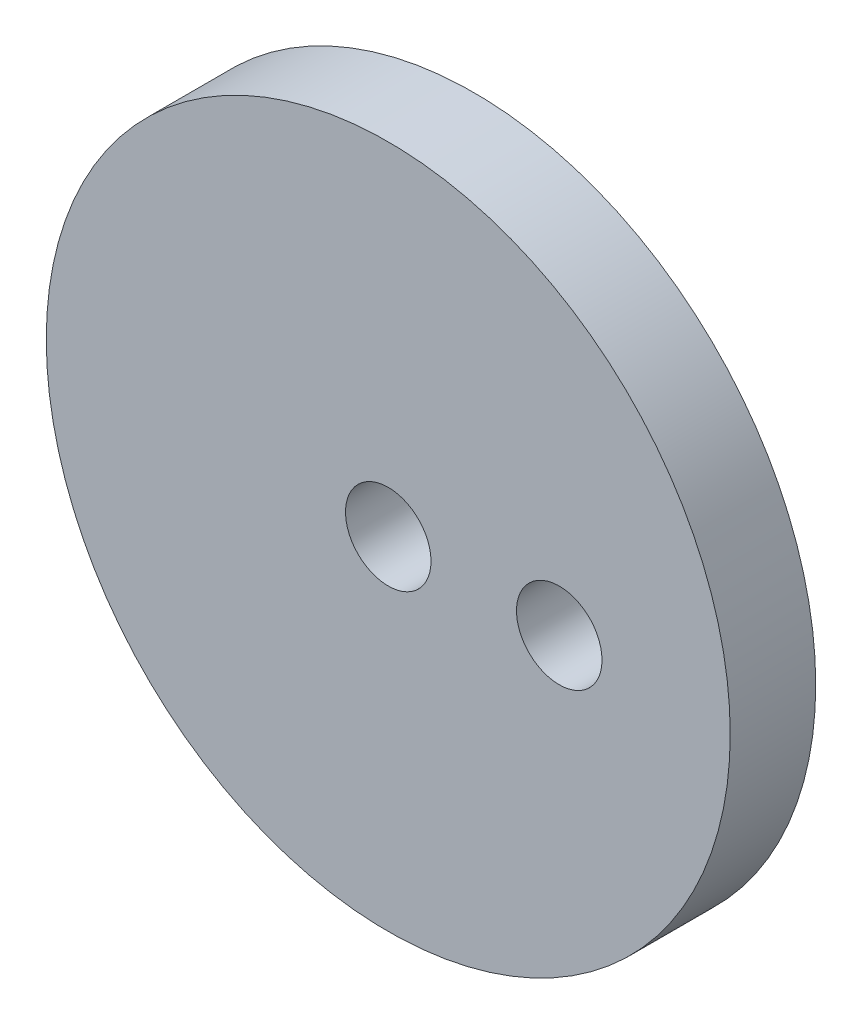
ISO-10303-21;
HEADER;
FILE_DESCRIPTION(('STEP AP214'),'2;1');
FILE_NAME('part.step','',(''),(''),'','','');
FILE_SCHEMA(('AUTOMOTIVE_DESIGN { 1 0 10303 214 1 1 1 1 }'));
ENDSEC;
DATA;
#1=APPLICATION_CONTEXT('core data for automotive mechanical design processes');
#2=APPLICATION_PROTOCOL_DEFINITION('international standard','automotive_design',2000,#1);
#3=PRODUCT_CONTEXT('',#1,'mechanical');
#4=PRODUCT('Part','Part','',(#3));
#5=PRODUCT_RELATED_PRODUCT_CATEGORY('part','',(#4));
#6=PRODUCT_DEFINITION_FORMATION('','',#4);
#7=PRODUCT_DEFINITION_CONTEXT('part definition',#1,'design');
#8=PRODUCT_DEFINITION('design','',#6,#7);
#9=PRODUCT_DEFINITION_SHAPE('','',#8);
#10=(LENGTH_UNIT() NAMED_UNIT(*) SI_UNIT(.MILLI.,.METRE.));
#11=(NAMED_UNIT(*) PLANE_ANGLE_UNIT() SI_UNIT($,.RADIAN.));
#12=(NAMED_UNIT(*) SI_UNIT($,.STERADIAN.) SOLID_ANGLE_UNIT());
#13=UNCERTAINTY_MEASURE_WITH_UNIT(LENGTH_MEASURE(1.E-05),#10,'distance_accuracy_value','');
#14=(GEOMETRIC_REPRESENTATION_CONTEXT(3) GLOBAL_UNCERTAINTY_ASSIGNED_CONTEXT((#13)) GLOBAL_UNIT_ASSIGNED_CONTEXT((#10,
#11,#12)) REPRESENTATION_CONTEXT('',''));
#15=CARTESIAN_POINT('',(0.,0.,0.));
#16=DIRECTION('',(0.,0.,1.));
#17=DIRECTION('',(1.,0.,0.));
#18=AXIS2_PLACEMENT_3D('',#15,#16,#17);
#19=CARTESIAN_POINT('',(0.,0.,6.35));
#20=DIRECTION('',(0.,0.,-1.));
#21=DIRECTION('',(-1.,0.,0.));
#22=AXIS2_PLACEMENT_3D('',#19,#20,#21);
#23=CYLINDRICAL_SURFACE('',#22,25.4);
#24=CARTESIAN_POINT('',(0.,0.,6.35));
#25=DIRECTION('',(0.,0.,1.));
#26=DIRECTION('',(1.,0.,0.));
#27=AXIS2_PLACEMENT_3D('',#24,#25,#26);
#28=CIRCLE('',#27,25.4);
#29=CARTESIAN_POINT('',(25.4,0.,6.35));
#30=VERTEX_POINT('',#29);
#31=EDGE_CURVE('E10',#30,#30,#28,.T.);
#32=ORIENTED_EDGE('',*,*,#31,.F.);
#33=EDGE_LOOP('',(#32));
#34=FACE_BOUND('',#33,.T.);
#35=CARTESIAN_POINT('',(0.,0.,0.));
#36=DIRECTION('',(0.,0.,1.));
#37=DIRECTION('',(1.,0.,0.));
#38=AXIS2_PLACEMENT_3D('',#35,#36,#37);
#39=CIRCLE('',#38,25.4);
#40=CARTESIAN_POINT('',(25.4,0.,0.));
#41=VERTEX_POINT('',#40);
#42=EDGE_CURVE('E46',#41,#41,#39,.T.);
#43=ORIENTED_EDGE('',*,*,#42,.T.);
#44=EDGE_LOOP('',(#43));
#45=FACE_BOUND('',#44,.T.);
#46=ADVANCED_FACE('F43',(#34,#45),#23,.T.);
#47=CARTESIAN_POINT('',(0.,0.,6.35));
#48=DIRECTION('',(0.,0.,1.));
#49=DIRECTION('',(1.,0.,0.));
#50=AXIS2_PLACEMENT_3D('',#47,#48,#49);
#51=PLANE('',#50);
#52=CARTESIAN_POINT('',(12.7,0.,6.35));
#53=DIRECTION('',(0.,0.,1.));
#54=DIRECTION('',(1.,0.,0.));
#55=AXIS2_PLACEMENT_3D('',#52,#53,#54);
#56=CIRCLE('',#55,3.175);
#57=CARTESIAN_POINT('',(15.875,0.,6.35));
#58=VERTEX_POINT('',#57);
#59=EDGE_CURVE('E65',#58,#58,#56,.T.);
#60=ORIENTED_EDGE('',*,*,#59,.F.);
#61=EDGE_LOOP('',(#60));
#62=FACE_BOUND('',#61,.T.);
#63=CARTESIAN_POINT('',(0.,0.,6.35));
#64=DIRECTION('',(0.,0.,1.));
#65=DIRECTION('',(1.,0.,0.));
#66=AXIS2_PLACEMENT_3D('',#63,#64,#65);
#67=CIRCLE('',#66,3.175);
#68=CARTESIAN_POINT('',(3.175,0.,6.35));
#69=VERTEX_POINT('',#68);
#70=EDGE_CURVE('E61',#69,#69,#67,.T.);
#71=ORIENTED_EDGE('',*,*,#70,.F.);
#72=EDGE_LOOP('',(#71));
#73=FACE_BOUND('',#72,.T.);
#74=ORIENTED_EDGE('',*,*,#31,.T.);
#75=EDGE_LOOP('',(#74));
#76=FACE_BOUND('',#75,.T.);
#77=ADVANCED_FACE('F83',(#62,#73,#76),#51,.T.);
#78=CARTESIAN_POINT('',(0.,0.,0.));
#79=DIRECTION('',(0.,0.,1.));
#80=DIRECTION('',(1.,0.,0.));
#81=AXIS2_PLACEMENT_3D('',#78,#79,#80);
#82=PLANE('',#81);
#83=CARTESIAN_POINT('',(12.7,0.,0.));
#84=DIRECTION('',(0.,0.,1.));
#85=DIRECTION('',(1.,0.,0.));
#86=AXIS2_PLACEMENT_3D('',#83,#84,#85);
#87=CIRCLE('',#86,3.175);
#88=CARTESIAN_POINT('',(15.875,0.,0.));
#89=VERTEX_POINT('',#88);
#90=EDGE_CURVE('E55',#89,#89,#87,.T.);
#91=ORIENTED_EDGE('',*,*,#90,.T.);
#92=EDGE_LOOP('',(#91));
#93=FACE_BOUND('',#92,.T.);
#94=CARTESIAN_POINT('',(0.,0.,0.));
#95=DIRECTION('',(0.,0.,1.));
#96=DIRECTION('',(1.,0.,0.));
#97=AXIS2_PLACEMENT_3D('',#94,#95,#96);
#98=CIRCLE('',#97,3.175);
#99=CARTESIAN_POINT('',(3.175,0.,0.));
#100=VERTEX_POINT('',#99);
#101=EDGE_CURVE('E57',#100,#100,#98,.T.);
#102=ORIENTED_EDGE('',*,*,#101,.T.);
#103=EDGE_LOOP('',(#102));
#104=FACE_BOUND('',#103,.T.);
#105=ORIENTED_EDGE('',*,*,#42,.F.);
#106=EDGE_LOOP('',(#105));
#107=FACE_BOUND('',#106,.T.);
#108=ADVANCED_FACE('F73',(#93,#104,#107),#82,.F.);
#109=CARTESIAN_POINT('',(0.,0.,0.));
#110=DIRECTION('',(0.,0.,1.));
#111=DIRECTION('',(1.,0.,0.));
#112=AXIS2_PLACEMENT_3D('',#109,#110,#111);
#113=CYLINDRICAL_SURFACE('',#112,3.175);
#114=ORIENTED_EDGE('',*,*,#101,.F.);
#115=EDGE_LOOP('',(#114));
#116=FACE_BOUND('',#115,.T.);
#117=ORIENTED_EDGE('',*,*,#70,.T.);
#118=EDGE_LOOP('',(#117));
#119=FACE_BOUND('',#118,.T.);
#120=ADVANCED_FACE('F79',(#116,#119),#113,.F.);
#121=CARTESIAN_POINT('',(12.7,0.,0.));
#122=DIRECTION('',(0.,0.,1.));
#123=DIRECTION('',(1.,0.,0.));
#124=AXIS2_PLACEMENT_3D('',#121,#122,#123);
#125=CYLINDRICAL_SURFACE('',#124,3.175);
#126=ORIENTED_EDGE('',*,*,#90,.F.);
#127=EDGE_LOOP('',(#126));
#128=FACE_BOUND('',#127,.T.);
#129=ORIENTED_EDGE('',*,*,#59,.T.);
#130=EDGE_LOOP('',(#129));
#131=FACE_BOUND('',#130,.T.);
#132=ADVANCED_FACE('F76',(#128,#131),#125,.F.);
#133=CLOSED_SHELL('',(#46,#77,#108,#120,#132));
#134=MANIFOLD_SOLID_BREP('B2',#133);
#135=ADVANCED_BREP_SHAPE_REPRESENTATION('',(#18,#134),#14);
#136=SHAPE_DEFINITION_REPRESENTATION(#9,#135);
ENDSEC;
END-ISO-10303-21;
